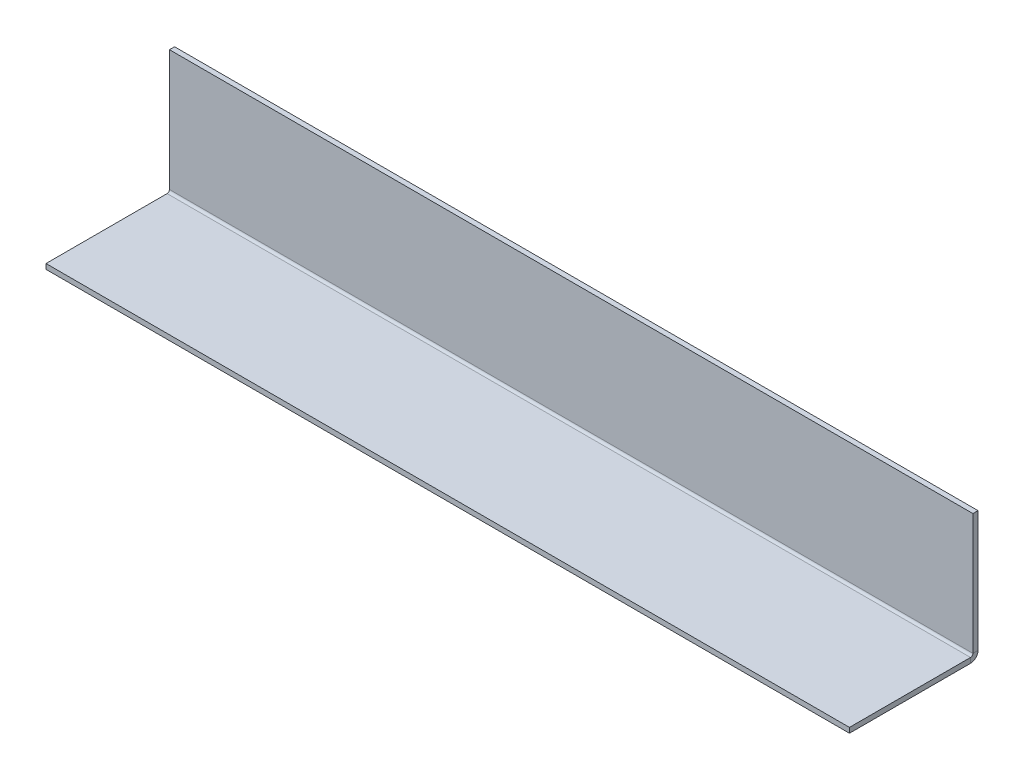
ISO-10303-21;
HEADER;
FILE_DESCRIPTION(('STEP AP214'),'2;1');
FILE_NAME('part.step','',(''),(''),'','','');
FILE_SCHEMA(('AUTOMOTIVE_DESIGN { 1 0 10303 214 1 1 1 1 }'));
ENDSEC;
DATA;
#1=APPLICATION_CONTEXT('core data for automotive mechanical design processes');
#2=APPLICATION_PROTOCOL_DEFINITION('international standard','automotive_design',2000,#1);
#3=PRODUCT_CONTEXT('',#1,'mechanical');
#4=PRODUCT('Part','Part','',(#3));
#5=PRODUCT_RELATED_PRODUCT_CATEGORY('part','',(#4));
#6=PRODUCT_DEFINITION_FORMATION('','',#4);
#7=PRODUCT_DEFINITION_CONTEXT('part definition',#1,'design');
#8=PRODUCT_DEFINITION('design','',#6,#7);
#9=PRODUCT_DEFINITION_SHAPE('','',#8);
#10=(LENGTH_UNIT() NAMED_UNIT(*) SI_UNIT(.MILLI.,.METRE.));
#11=(NAMED_UNIT(*) PLANE_ANGLE_UNIT() SI_UNIT($,.RADIAN.));
#12=(NAMED_UNIT(*) SI_UNIT($,.STERADIAN.) SOLID_ANGLE_UNIT());
#13=UNCERTAINTY_MEASURE_WITH_UNIT(LENGTH_MEASURE(1.E-05),#10,'distance_accuracy_value','');
#14=(GEOMETRIC_REPRESENTATION_CONTEXT(3) GLOBAL_UNCERTAINTY_ASSIGNED_CONTEXT((#13)) GLOBAL_UNIT_ASSIGNED_CONTEXT((#10,
#11,#12)) REPRESENTATION_CONTEXT('',''));
#15=CARTESIAN_POINT('',(0.,0.,0.));
#16=DIRECTION('',(0.,0.,1.));
#17=DIRECTION('',(1.,0.,0.));
#18=AXIS2_PLACEMENT_3D('',#15,#16,#17);
#19=CARTESIAN_POINT('',(-125.,-1.5875,40.));
#20=DIRECTION('',(0.,1.,0.));
#21=DIRECTION('',(-1.,0.,0.));
#22=AXIS2_PLACEMENT_3D('',#19,#20,#21);
#23=PLANE('',#22);
#24=DIRECTION('',(-1.,0.,0.));
#25=VECTOR('',#24,1.);
#26=CARTESIAN_POINT('',(-125.,-1.58750000000004,2.32409999999999));
#27=LINE('',#26,#25);
#28=CARTESIAN_POINT('',(-125.,-1.58750000000004,2.32409999999999));
#29=VERTEX_POINT('',#28);
#30=CARTESIAN_POINT('',(125.,-1.58749999999995,2.32409999999999));
#31=VERTEX_POINT('',#30);
#32=EDGE_CURVE('E165',#29,#31,#27,.F.);
#33=ORIENTED_EDGE('',*,*,#32,.T.);
#34=DIRECTION('',(0.,0.,-1.));
#35=VECTOR('',#34,1.);
#36=CARTESIAN_POINT('',(125.,-1.58749999999995,40.));
#37=LINE('',#36,#35);
#38=CARTESIAN_POINT('',(125.,-1.58749999999995,40.));
#39=VERTEX_POINT('',#38);
#40=EDGE_CURVE('E13',#39,#31,#37,.T.);
#41=ORIENTED_EDGE('',*,*,#40,.F.);
#42=DIRECTION('',(1.,0.,0.));
#43=VECTOR('',#42,1.);
#44=CARTESIAN_POINT('',(-125.,-1.5875,40.));
#45=LINE('',#44,#43);
#46=CARTESIAN_POINT('',(-125.,-1.5875,40.));
#47=VERTEX_POINT('',#46);
#48=EDGE_CURVE('E186',#47,#39,#45,.T.);
#49=ORIENTED_EDGE('',*,*,#48,.F.);
#50=DIRECTION('',(0.,0.,-1.));
#51=VECTOR('',#50,1.);
#52=CARTESIAN_POINT('',(-125.,-1.5875,40.));
#53=LINE('',#52,#51);
#54=EDGE_CURVE('E71',#47,#29,#53,.T.);
#55=ORIENTED_EDGE('',*,*,#54,.T.);
#56=EDGE_LOOP('',(#33,#41,#49,#55));
#57=FACE_BOUND('',#56,.T.);
#58=ADVANCED_FACE('F57',(#57),#23,.F.);
#59=CARTESIAN_POINT('',(-125.,0.,40.));
#60=DIRECTION('',(0.,1.,0.));
#61=DIRECTION('',(-1.,0.,0.));
#62=AXIS2_PLACEMENT_3D('',#59,#60,#61);
#63=PLANE('',#62);
#64=DIRECTION('',(0.,0.,-1.));
#65=VECTOR('',#64,1.);
#66=CARTESIAN_POINT('',(125.,0.,40.));
#67=LINE('',#66,#65);
#68=CARTESIAN_POINT('',(125.,0.,40.));
#69=VERTEX_POINT('',#68);
#70=CARTESIAN_POINT('',(125.,0.,2.32409999999999));
#71=VERTEX_POINT('',#70);
#72=EDGE_CURVE('E64',#69,#71,#67,.T.);
#73=ORIENTED_EDGE('',*,*,#72,.T.);
#74=DIRECTION('',(-1.,0.,0.));
#75=VECTOR('',#74,1.);
#76=CARTESIAN_POINT('',(-125.,0.,2.32409999999999));
#77=LINE('',#76,#75);
#78=CARTESIAN_POINT('',(-125.,0.,2.32409999999999));
#79=VERTEX_POINT('',#78);
#80=EDGE_CURVE('E177',#79,#71,#77,.F.);
#81=ORIENTED_EDGE('',*,*,#80,.F.);
#82=DIRECTION('',(0.,0.,-1.));
#83=VECTOR('',#82,1.);
#84=CARTESIAN_POINT('',(-125.,0.,40.));
#85=LINE('',#84,#83);
#86=CARTESIAN_POINT('',(-125.,0.,40.));
#87=VERTEX_POINT('',#86);
#88=EDGE_CURVE('E79',#87,#79,#85,.T.);
#89=ORIENTED_EDGE('',*,*,#88,.F.);
#90=DIRECTION('',(1.,0.,0.));
#91=VECTOR('',#90,1.);
#92=CARTESIAN_POINT('',(-125.,0.,40.));
#93=LINE('',#92,#91);
#94=EDGE_CURVE('E192',#87,#69,#93,.T.);
#95=ORIENTED_EDGE('',*,*,#94,.T.);
#96=EDGE_LOOP('',(#73,#81,#89,#95));
#97=FACE_BOUND('',#96,.T.);
#98=ADVANCED_FACE('F198',(#97),#63,.T.);
#99=CARTESIAN_POINT('',(-125.,-1.5875,40.));
#100=DIRECTION('',(-1.,0.,0.));
#101=DIRECTION('',(0.,0.,1.));
#102=AXIS2_PLACEMENT_3D('',#99,#100,#101);
#103=PLANE('',#102);
#104=ORIENTED_EDGE('',*,*,#88,.T.);
#105=DIRECTION('',(0.,-1.,0.));
#106=VECTOR('',#105,1.);
#107=CARTESIAN_POINT('',(-125.,0.,2.32409999999999));
#108=LINE('',#107,#106);
#109=EDGE_CURVE('E171',#79,#29,#108,.T.);
#110=ORIENTED_EDGE('',*,*,#109,.T.);
#111=ORIENTED_EDGE('',*,*,#54,.F.);
#112=DIRECTION('',(0.,1.,0.));
#113=VECTOR('',#112,1.);
#114=CARTESIAN_POINT('',(-125.,-1.5875,40.));
#115=LINE('',#114,#113);
#116=EDGE_CURVE('E194',#47,#87,#115,.T.);
#117=ORIENTED_EDGE('',*,*,#116,.T.);
#118=EDGE_LOOP('',(#104,#110,#111,#117));
#119=FACE_BOUND('',#118,.T.);
#120=ADVANCED_FACE('F221',(#119),#103,.T.);
#121=CARTESIAN_POINT('',(125.,0.,40.));
#122=DIRECTION('',(1.,0.,0.));
#123=DIRECTION('',(0.,0.,-1.));
#124=AXIS2_PLACEMENT_3D('',#121,#122,#123);
#125=PLANE('',#124);
#126=DIRECTION('',(0.,-1.,0.));
#127=VECTOR('',#126,1.);
#128=CARTESIAN_POINT('',(125.,0.,2.32409999999999));
#129=LINE('',#128,#127);
#130=EDGE_CURVE('E183',#71,#31,#129,.T.);
#131=ORIENTED_EDGE('',*,*,#130,.F.);
#132=ORIENTED_EDGE('',*,*,#72,.F.);
#133=DIRECTION('',(0.,-1.,0.));
#134=VECTOR('',#133,1.);
#135=CARTESIAN_POINT('',(125.,0.,40.));
#136=LINE('',#135,#134);
#137=EDGE_CURVE('E189',#69,#39,#136,.T.);
#138=ORIENTED_EDGE('',*,*,#137,.T.);
#139=ORIENTED_EDGE('',*,*,#40,.T.);
#140=EDGE_LOOP('',(#131,#132,#138,#139));
#141=FACE_BOUND('',#140,.T.);
#142=ADVANCED_FACE('F226',(#141),#125,.T.);
#143=CARTESIAN_POINT('',(0.,0.,40.));
#144=DIRECTION('',(0.,0.,-1.));
#145=DIRECTION('',(-1.,0.,0.));
#146=AXIS2_PLACEMENT_3D('',#143,#144,#145);
#147=PLANE('',#146);
#148=ORIENTED_EDGE('',*,*,#48,.T.);
#149=ORIENTED_EDGE('',*,*,#137,.F.);
#150=ORIENTED_EDGE('',*,*,#94,.F.);
#151=ORIENTED_EDGE('',*,*,#116,.F.);
#152=EDGE_LOOP('',(#148,#149,#150,#151));
#153=FACE_BOUND('',#152,.T.);
#154=ADVANCED_FACE('F224',(#153),#147,.F.);
#155=CARTESIAN_POINT('',(125.,0.73660000000002,2.32409999999999));
#156=DIRECTION('',(1.,0.,0.));
#157=DIRECTION('',(0.,1.,0.));
#158=AXIS2_PLACEMENT_3D('',#155,#156,#157);
#159=PLANE('',#158);
#160=DIRECTION('',(0.,0.,1.));
#161=VECTOR('',#160,1.);
#162=CARTESIAN_POINT('',(125.,0.736600000000031,0.));
#163=LINE('',#162,#161);
#164=CARTESIAN_POINT('',(125.,0.736600000000017,1.58749999999999));
#165=VERTEX_POINT('',#164);
#166=CARTESIAN_POINT('',(125.,0.736600000000012,0.));
#167=VERTEX_POINT('',#166);
#168=EDGE_CURVE('E147',#165,#167,#163,.F.);
#169=ORIENTED_EDGE('',*,*,#168,.F.);
#170=CARTESIAN_POINT('',(125.,0.73660000000002,2.32409999999999));
#171=DIRECTION('',(-1.,0.,0.));
#172=DIRECTION('',(0.,-1.,0.));
#173=AXIS2_PLACEMENT_3D('',#170,#171,#172);
#174=CIRCLE('',#173,0.7366);
#175=EDGE_CURVE('E174',#71,#165,#174,.F.);
#176=ORIENTED_EDGE('',*,*,#175,.F.);
#177=ORIENTED_EDGE('',*,*,#130,.T.);
#178=CARTESIAN_POINT('',(125.,0.73660000000002,2.32409999999999));
#179=DIRECTION('',(-1.,0.,0.));
#180=DIRECTION('',(0.,-1.,0.));
#181=AXIS2_PLACEMENT_3D('',#178,#179,#180);
#182=CIRCLE('',#181,2.3241);
#183=EDGE_CURVE('E167',#31,#167,#182,.F.);
#184=ORIENTED_EDGE('',*,*,#183,.T.);
#185=EDGE_LOOP('',(#169,#176,#177,#184));
#186=FACE_BOUND('',#185,.T.);
#187=ADVANCED_FACE('F207',(#186),#159,.T.);
#188=CARTESIAN_POINT('',(-125.,0.736599999999965,2.32409999999999));
#189=DIRECTION('',(1.,0.,0.));
#190=DIRECTION('',(0.,1.,0.));
#191=AXIS2_PLACEMENT_3D('',#188,#189,#190);
#192=PLANE('',#191);
#193=CARTESIAN_POINT('',(-125.,0.736599999999965,2.32409999999999));
#194=DIRECTION('',(-1.,0.,0.));
#195=DIRECTION('',(0.,-1.,0.));
#196=AXIS2_PLACEMENT_3D('',#193,#194,#195);
#197=CIRCLE('',#196,0.7366);
#198=CARTESIAN_POINT('',(-125.,0.736599999999962,1.58749999999999));
#199=VERTEX_POINT('',#198);
#200=EDGE_CURVE('E180',#199,#79,#197,.T.);
#201=ORIENTED_EDGE('',*,*,#200,.F.);
#202=DIRECTION('',(0.,0.,1.));
#203=VECTOR('',#202,1.);
#204=CARTESIAN_POINT('',(-125.,0.736599999999974,1.58749999999997));
#205=LINE('',#204,#203);
#206=CARTESIAN_POINT('',(-125.,0.736599999999985,0.));
#207=VERTEX_POINT('',#206);
#208=EDGE_CURVE('E159',#199,#207,#205,.F.);
#209=ORIENTED_EDGE('',*,*,#208,.T.);
#210=CARTESIAN_POINT('',(-125.,0.736599999999965,2.32409999999999));
#211=DIRECTION('',(-1.,0.,0.));
#212=DIRECTION('',(0.,-1.,0.));
#213=AXIS2_PLACEMENT_3D('',#210,#211,#212);
#214=CIRCLE('',#213,2.3241);
#215=EDGE_CURVE('E168',#207,#29,#214,.T.);
#216=ORIENTED_EDGE('',*,*,#215,.T.);
#217=ORIENTED_EDGE('',*,*,#109,.F.);
#218=EDGE_LOOP('',(#201,#209,#216,#217));
#219=FACE_BOUND('',#218,.T.);
#220=ADVANCED_FACE('F220',(#219),#192,.F.);
#221=CARTESIAN_POINT('',(-125.,0.736599999999965,2.32409999999999));
#222=DIRECTION('',(-1.,0.,0.));
#223=DIRECTION('',(0.,0.,-1.));
#224=AXIS2_PLACEMENT_3D('',#221,#222,#223);
#225=CYLINDRICAL_SURFACE('',#224,2.3241);
#226=ORIENTED_EDGE('',*,*,#32,.F.);
#227=ORIENTED_EDGE('',*,*,#215,.F.);
#228=DIRECTION('',(-1.,0.,0.));
#229=VECTOR('',#228,1.);
#230=CARTESIAN_POINT('',(125.,0.736600000000031,0.));
#231=LINE('',#230,#229);
#232=EDGE_CURVE('E157',#207,#167,#231,.F.);
#233=ORIENTED_EDGE('',*,*,#232,.T.);
#234=ORIENTED_EDGE('',*,*,#183,.F.);
#235=EDGE_LOOP('',(#226,#227,#233,#234));
#236=FACE_BOUND('',#235,.T.);
#237=ADVANCED_FACE('F211',(#236),#225,.T.);
#238=CARTESIAN_POINT('',(-125.,0.736599999999965,2.32409999999999));
#239=DIRECTION('',(-1.,0.,0.));
#240=DIRECTION('',(0.,0.,-1.));
#241=AXIS2_PLACEMENT_3D('',#238,#239,#240);
#242=CYLINDRICAL_SURFACE('',#241,0.7366);
#243=ORIENTED_EDGE('',*,*,#80,.T.);
#244=ORIENTED_EDGE('',*,*,#175,.T.);
#245=DIRECTION('',(-1.,0.,0.));
#246=VECTOR('',#245,1.);
#247=CARTESIAN_POINT('',(125.,0.73660000000002,1.58749999999997));
#248=LINE('',#247,#246);
#249=EDGE_CURVE('E162',#165,#199,#248,.T.);
#250=ORIENTED_EDGE('',*,*,#249,.T.);
#251=ORIENTED_EDGE('',*,*,#200,.T.);
#252=EDGE_LOOP('',(#243,#244,#250,#251));
#253=FACE_BOUND('',#252,.T.);
#254=ADVANCED_FACE('F203',(#253),#242,.F.);
#255=CARTESIAN_POINT('',(-125.,38.4125,-1.34224228953705E-13));
#256=DIRECTION('',(1.,0.,0.));
#257=DIRECTION('',(0.,0.,-1.));
#258=AXIS2_PLACEMENT_3D('',#255,#256,#257);
#259=PLANE('',#258);
#260=ORIENTED_EDGE('',*,*,#208,.F.);
#261=DIRECTION('',(0.,-1.,0.));
#262=VECTOR('',#261,1.);
#263=CARTESIAN_POINT('',(-125.,38.4125,1.58749999999987));
#264=LINE('',#263,#262);
#265=CARTESIAN_POINT('',(-125.,38.4125,1.58749999999987));
#266=VERTEX_POINT('',#265);
#267=EDGE_CURVE('E155',#199,#266,#264,.F.);
#268=ORIENTED_EDGE('',*,*,#267,.T.);
#269=DIRECTION('',(0.,0.,1.));
#270=VECTOR('',#269,1.);
#271=CARTESIAN_POINT('',(-125.,38.4125,-1.34224228953705E-13));
#272=LINE('',#271,#270);
#273=CARTESIAN_POINT('',(-125.,38.4125,-1.34116526928312E-13));
#274=VERTEX_POINT('',#273);
#275=EDGE_CURVE('E143',#274,#266,#272,.T.);
#276=ORIENTED_EDGE('',*,*,#275,.F.);
#277=DIRECTION('',(0.,1.,0.));
#278=VECTOR('',#277,1.);
#279=CARTESIAN_POINT('',(-125.,0.,0.));
#280=LINE('',#279,#278);
#281=EDGE_CURVE('E130',#207,#274,#280,.T.);
#282=ORIENTED_EDGE('',*,*,#281,.F.);
#283=EDGE_LOOP('',(#260,#268,#276,#282));
#284=FACE_BOUND('',#283,.T.);
#285=ADVANCED_FACE('F214',(#284),#259,.F.);
#286=CARTESIAN_POINT('',(125.,0.,0.));
#287=DIRECTION('',(-1.,0.,0.));
#288=DIRECTION('',(0.,-1.,0.));
#289=AXIS2_PLACEMENT_3D('',#286,#287,#288);
#290=PLANE('',#289);
#291=ORIENTED_EDGE('',*,*,#168,.T.);
#292=DIRECTION('',(0.,-1.,0.));
#293=VECTOR('',#292,1.);
#294=CARTESIAN_POINT('',(125.,0.,0.));
#295=LINE('',#294,#293);
#296=CARTESIAN_POINT('',(125.,38.4125,-1.34116526928312E-13));
#297=VERTEX_POINT('',#296);
#298=EDGE_CURVE('E128',#297,#167,#295,.T.);
#299=ORIENTED_EDGE('',*,*,#298,.F.);
#300=DIRECTION('',(0.,0.,1.));
#301=VECTOR('',#300,1.);
#302=CARTESIAN_POINT('',(125.,38.4125,-1.34116526928312E-13));
#303=LINE('',#302,#301);
#304=CARTESIAN_POINT('',(125.,38.4125,1.58749999999987));
#305=VERTEX_POINT('',#304);
#306=EDGE_CURVE('E136',#297,#305,#303,.T.);
#307=ORIENTED_EDGE('',*,*,#306,.T.);
#308=DIRECTION('',(0.,1.,0.));
#309=VECTOR('',#308,1.);
#310=CARTESIAN_POINT('',(125.,0.,1.5875));
#311=LINE('',#310,#309);
#312=EDGE_CURVE('E152',#305,#165,#311,.F.);
#313=ORIENTED_EDGE('',*,*,#312,.T.);
#314=EDGE_LOOP('',(#291,#299,#307,#313));
#315=FACE_BOUND('',#314,.T.);
#316=ADVANCED_FACE('F146',(#315),#290,.F.);
#317=CARTESIAN_POINT('',(0.,0.,0.));
#318=DIRECTION('',(0.,0.,1.));
#319=DIRECTION('',(0.,-1.,0.));
#320=AXIS2_PLACEMENT_3D('',#317,#318,#319);
#321=PLANE('',#320);
#322=ORIENTED_EDGE('',*,*,#232,.F.);
#323=ORIENTED_EDGE('',*,*,#281,.T.);
#324=DIRECTION('',(1.,0.,0.));
#325=VECTOR('',#324,1.);
#326=CARTESIAN_POINT('',(0.,38.4125,-1.34116526928312E-13));
#327=LINE('',#326,#325);
#328=EDGE_CURVE('E123',#274,#297,#327,.T.);
#329=ORIENTED_EDGE('',*,*,#328,.T.);
#330=ORIENTED_EDGE('',*,*,#298,.T.);
#331=EDGE_LOOP('',(#322,#323,#329,#330));
#332=FACE_BOUND('',#331,.T.);
#333=ADVANCED_FACE('F126',(#332),#321,.F.);
#334=CARTESIAN_POINT('',(0.,0.,1.5875));
#335=DIRECTION('',(0.,0.,1.));
#336=DIRECTION('',(0.,-1.,0.));
#337=AXIS2_PLACEMENT_3D('',#334,#335,#336);
#338=PLANE('',#337);
#339=ORIENTED_EDGE('',*,*,#267,.F.);
#340=ORIENTED_EDGE('',*,*,#249,.F.);
#341=ORIENTED_EDGE('',*,*,#312,.F.);
#342=DIRECTION('',(-1.,0.,0.));
#343=VECTOR('',#342,1.);
#344=CARTESIAN_POINT('',(125.,38.4125,1.58749999999987));
#345=LINE('',#344,#343);
#346=EDGE_CURVE('E139',#266,#305,#345,.F.);
#347=ORIENTED_EDGE('',*,*,#346,.F.);
#348=EDGE_LOOP('',(#339,#340,#341,#347));
#349=FACE_BOUND('',#348,.T.);
#350=ADVANCED_FACE('F217',(#349),#338,.T.);
#351=CARTESIAN_POINT('',(125.,38.4125,-1.34224228953705E-13));
#352=DIRECTION('',(0.,-1.,0.));
#353=DIRECTION('',(0.,0.,-1.));
#354=AXIS2_PLACEMENT_3D('',#351,#352,#353);
#355=PLANE('',#354);
#356=ORIENTED_EDGE('',*,*,#346,.T.);
#357=ORIENTED_EDGE('',*,*,#306,.F.);
#358=ORIENTED_EDGE('',*,*,#328,.F.);
#359=ORIENTED_EDGE('',*,*,#275,.T.);
#360=EDGE_LOOP('',(#356,#357,#358,#359));
#361=FACE_BOUND('',#360,.T.);
#362=ADVANCED_FACE('F137',(#361),#355,.F.);
#363=CLOSED_SHELL('',(#58,#98,#120,#142,#154,#187,#220,#237,#254,#285,#316,#333,#350,#362));
#364=MANIFOLD_SOLID_BREP('B2',#363);
#365=ADVANCED_BREP_SHAPE_REPRESENTATION('',(#18,#364),#14);
#366=SHAPE_DEFINITION_REPRESENTATION(#9,#365);
ENDSEC;
END-ISO-10303-21;
